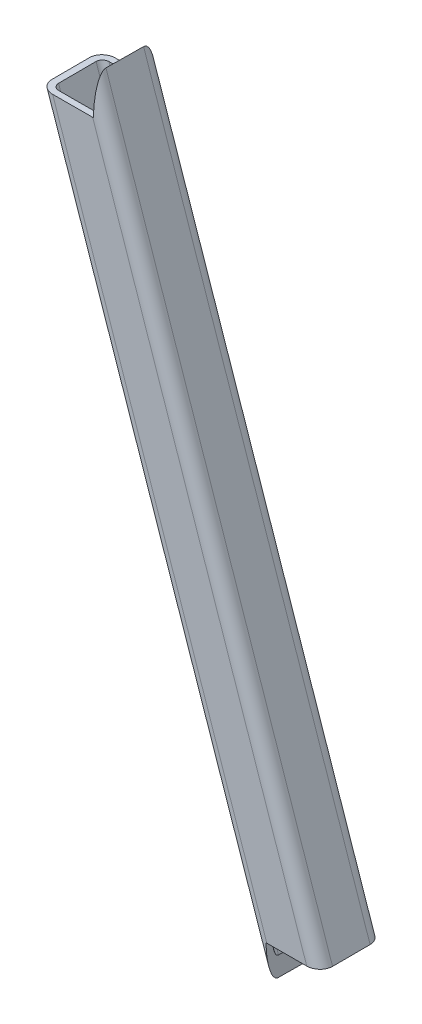
ISO-10303-21;
HEADER;
FILE_DESCRIPTION(('STEP AP214'),'2;1');
FILE_NAME('part.step','',(''),(''),'','','');
FILE_SCHEMA(('AUTOMOTIVE_DESIGN { 1 0 10303 214 1 1 1 1 }'));
ENDSEC;
DATA;
#1=APPLICATION_CONTEXT('core data for automotive mechanical design processes');
#2=APPLICATION_PROTOCOL_DEFINITION('international standard','automotive_design',2000,#1);
#3=PRODUCT_CONTEXT('',#1,'mechanical');
#4=PRODUCT('Part','Part','',(#3));
#5=PRODUCT_RELATED_PRODUCT_CATEGORY('part','',(#4));
#6=PRODUCT_DEFINITION_FORMATION('','',#4);
#7=PRODUCT_DEFINITION_CONTEXT('part definition',#1,'design');
#8=PRODUCT_DEFINITION('design','',#6,#7);
#9=PRODUCT_DEFINITION_SHAPE('','',#8);
#10=(LENGTH_UNIT() NAMED_UNIT(*) SI_UNIT(.MILLI.,.METRE.));
#11=(NAMED_UNIT(*) PLANE_ANGLE_UNIT() SI_UNIT($,.RADIAN.));
#12=(NAMED_UNIT(*) SI_UNIT($,.STERADIAN.) SOLID_ANGLE_UNIT());
#13=UNCERTAINTY_MEASURE_WITH_UNIT(LENGTH_MEASURE(1.E-05),#10,'distance_accuracy_value','');
#14=(GEOMETRIC_REPRESENTATION_CONTEXT(3) GLOBAL_UNCERTAINTY_ASSIGNED_CONTEXT((#13)) GLOBAL_UNIT_ASSIGNED_CONTEXT((#10,
#11,#12)) REPRESENTATION_CONTEXT('',''));
#15=CARTESIAN_POINT('',(0.,0.,0.));
#16=DIRECTION('',(0.,0.,1.));
#17=DIRECTION('',(1.,0.,0.));
#18=AXIS2_PLACEMENT_3D('',#15,#16,#17);
#19=CARTESIAN_POINT('',(-240.552316834698,223.22080107908,-2306.03056574602));
#20=DIRECTION('',(-0.946505758584915,-0.322672417699403,0.00305938255488657));
#21=DIRECTION('',(0.322673927788139,-0.94651018817854,0.));
#22=AXIS2_PLACEMENT_3D('',#19,#20,#21);
#23=PLANE('',#22);
#24=DIRECTION('',(0.,-0.00948096236960194,-0.999955054666232));
#25=VECTOR('',#24,1.);
#26=CARTESIAN_POINT('',(-240.,221.600817328539,-2306.01520605069));
#27=LINE('',#26,#25);
#28=CARTESIAN_POINT('',(-240.,221.714447827,-2294.03062190508));
#29=VERTEX_POINT('',#28);
#30=CARTESIAN_POINT('',(-240.,221.6006716973,-2306.03056574602));
#31=VERTEX_POINT('',#30);
#32=EDGE_CURVE('E290',#29,#31,#27,.T.);
#33=ORIENTED_EDGE('',*,*,#32,.F.);
#34=DIRECTION('',(0.322673927788139,-0.94651018817854,0.));
#35=VECTOR('',#34,1.);
#36=CARTESIAN_POINT('',(-240.517567993605,223.232647274908,-2294.03062190508));
#37=LINE('',#36,#35);
#38=CARTESIAN_POINT('',(-167.824620058977,10.,-2294.03062190508));
#39=VERTEX_POINT('',#38);
#40=EDGE_CURVE('E247',#29,#39,#37,.T.);
#41=ORIENTED_EDGE('',*,*,#40,.T.);
#42=DIRECTION('',(0.00323227465389861,0.,0.999994776186637));
#43=VECTOR('',#42,1.);
#44=CARTESIAN_POINT('',(-167.86416680053,10.,-2306.26551503834));
#45=LINE('',#44,#43);
#46=CARTESIAN_POINT('',(-167.86340737592,10.,-2306.03056574602));
#47=VERTEX_POINT('',#46);
#48=EDGE_CURVE('E266',#47,#39,#45,.T.);
#49=ORIENTED_EDGE('',*,*,#48,.F.);
#50=DIRECTION('',(0.322673927788139,-0.94651018817854,0.));
#51=VECTOR('',#50,1.);
#52=CARTESIAN_POINT('',(-240.552316834698,223.22080107908,-2306.03056574602));
#53=LINE('',#52,#51);
#54=EDGE_CURVE('E244',#31,#47,#53,.T.);
#55=ORIENTED_EDGE('',*,*,#54,.F.);
#56=EDGE_LOOP('',(#33,#41,#49,#55));
#57=FACE_BOUND('',#56,.T.);
#58=ADVANCED_FACE('F41',(#57),#23,.F.);
#59=CARTESIAN_POINT('',(-244.303591027944,221.94195760411,-2294.01838437486));
#60=DIRECTION('',(0.322673927788139,-0.94651018817854,0.));
#61=DIRECTION('',(0.94651018817854,0.322673927788139,0.));
#62=AXIS2_PLACEMENT_3D('',#59,#60,#61);
#63=CYLINDRICAL_SURFACE('',#62,3.99999999999994);
#64=CARTESIAN_POINT('',(-240.232469117452,210.,-2294.01838437486));
#65=DIRECTION('',(0.,1.,0.));
#66=DIRECTION('',(1.,0.,0.));
#67=AXIS2_PLACEMENT_3D('',#64,#65,#66);
#68=ELLIPSE('',#67,4.22605065424338,3.99999999999994);
#69=CARTESIAN_POINT('',(-240.219540011804,210.,-2290.01840309455));
#70=VERTEX_POINT('',#69);
#71=CARTESIAN_POINT('',(-240.,210.,-2290.02444085147));
#72=VERTEX_POINT('',#71);
#73=EDGE_CURVE('E229',#70,#72,#68,.T.);
#74=ORIENTED_EDGE('',*,*,#73,.F.);
#75=DIRECTION('',(0.322673927788139,-0.94651018817854,0.));
#76=VECTOR('',#75,1.);
#77=CARTESIAN_POINT('',(-244.292008080913,221.945906336053,-2290.01840309455));
#78=LINE('',#77,#76);
#79=CARTESIAN_POINT('',(-172.037721829986,10.,-2290.01840309455));
#80=VERTEX_POINT('',#79);
#81=EDGE_CURVE('E251',#70,#80,#78,.T.);
#82=ORIENTED_EDGE('',*,*,#81,.T.);
#83=CARTESIAN_POINT('',(-172.050650935634,10.,-2294.01838437486));
#84=DIRECTION('',(0.,-1.,0.));
#85=DIRECTION('',(1.,0.,0.));
#86=AXIS2_PLACEMENT_3D('',#83,#84,#85);
#87=ELLIPSE('',#86,4.22605065424338,3.99999999999994);
#88=EDGE_CURVE('E197',#39,#80,#87,.T.);
#89=ORIENTED_EDGE('',*,*,#88,.F.);
#90=ORIENTED_EDGE('',*,*,#40,.F.);
#91=CARTESIAN_POINT('',(-240.,209.318090588806,-2294.01838437486));
#92=DIRECTION('',(-1.,0.,0.));
#93=DIRECTION('',(0.,-1.,0.));
#94=AXIS2_PLACEMENT_3D('',#91,#92,#93);
#95=ELLIPSE('',#94,12.3964152524473,3.99999999999994);
#96=EDGE_CURVE('E346',#72,#29,#95,.T.);
#97=ORIENTED_EDGE('',*,*,#96,.F.);
#98=EDGE_LOOP('',(#74,#82,#89,#90,#97));
#99=FACE_BOUND('',#98,.T.);
#100=ADVANCED_FACE('F371',(#99),#63,.T.);
#101=CARTESIAN_POINT('',(-255.650077183932,218.073837323659,-2289.98169050389));
#102=DIRECTION('',(-0.00289573675775556,-0.000987182985598487,-0.99999532007824));
#103=DIRECTION('',(-0.99999580734144,0.,0.00289573816874812));
#104=AXIS2_PLACEMENT_3D('',#101,#102,#103);
#105=PLANE('',#104);
#106=DIRECTION('',(0.99999580734144,0.,-0.00289573816874812));
#107=VECTOR('',#106,1.);
#108=CARTESIAN_POINT('',(-255.65005410386,210.,-2289.97372017859));
#109=LINE('',#108,#107);
#110=CARTESIAN_POINT('',(-252.897632641826,210.,-2289.98169050389));
#111=VERTEX_POINT('',#110);
#112=EDGE_CURVE('E231',#111,#70,#109,.T.);
#113=ORIENTED_EDGE('',*,*,#112,.F.);
#114=DIRECTION('',(0.322673927788139,-0.94651018817854,0.));
#115=VECTOR('',#114,1.);
#116=CARTESIAN_POINT('',(-255.650077183932,218.073837323659,-2289.98169050389));
#117=LINE('',#116,#115);
#118=CARTESIAN_POINT('',(-184.715814459964,10.,-2289.98169050389));
#119=VERTEX_POINT('',#118);
#120=EDGE_CURVE('E254',#111,#119,#117,.T.);
#121=ORIENTED_EDGE('',*,*,#120,.T.);
#122=DIRECTION('',(-0.99999580734144,0.,0.00289573816874812));
#123=VECTOR('',#122,1.);
#124=CARTESIAN_POINT('',(-255.649482378891,10.,-2289.77628431305));
#125=LINE('',#124,#123);
#126=EDGE_CURVE('E185',#80,#119,#125,.T.);
#127=ORIENTED_EDGE('',*,*,#126,.F.);
#128=ORIENTED_EDGE('',*,*,#81,.F.);
#129=EDGE_LOOP('',(#113,#121,#127,#128));
#130=FACE_BOUND('',#129,.T.);
#131=ADVANCED_FACE('F375',(#130),#105,.F.);
#132=CARTESIAN_POINT('',(-255.661660130963,218.069888591717,-2293.9816717842));
#133=DIRECTION('',(0.322673927788139,-0.94651018817854,0.));
#134=DIRECTION('',(0.94651018817854,0.322673927788139,0.));
#135=AXIS2_PLACEMENT_3D('',#132,#133,#134);
#136=CYLINDRICAL_SURFACE('',#135,3.99999999999996);
#137=CARTESIAN_POINT('',(-252.910561747423,210.,-2293.9816717842));
#138=DIRECTION('',(0.,1.,0.));
#139=DIRECTION('',(1.,0.,0.));
#140=AXIS2_PLACEMENT_3D('',#137,#138,#139);
#141=ELLIPSE('',#140,4.2260506542434,3.99999999999996);
#142=CARTESIAN_POINT('',(-257.13659262408,210.,-2293.96943425398));
#143=VERTEX_POINT('',#142);
#144=EDGE_CURVE('E233',#143,#111,#141,.T.);
#145=ORIENTED_EDGE('',*,*,#144,.F.);
#146=DIRECTION('',(0.322673927788139,-0.94651018817854,0.));
#147=VECTOR('',#146,1.);
#148=CARTESIAN_POINT('',(-259.447683165303,216.779198920919,-2293.96943425398));
#149=LINE('',#148,#147);
#150=CARTESIAN_POINT('',(-184.999999999999,-1.60067169730313,-2293.96943425398));
#151=VERTEX_POINT('',#150);
#152=EDGE_CURVE('E204',#143,#151,#149,.T.);
#153=ORIENTED_EDGE('',*,*,#152,.T.);
#154=CARTESIAN_POINT('',(-184.999999999999,10.7956855408894,-2293.9816717842));
#155=DIRECTION('',(1.,0.,0.));
#156=DIRECTION('',(0.,-1.,0.));
#157=AXIS2_PLACEMENT_3D('',#154,#155,#156);
#158=ELLIPSE('',#157,12.3964152524473,3.99999999999996);
#159=CARTESIAN_POINT('',(-184.999999999999,10.,-2289.98992016506));
#160=VERTEX_POINT('',#159);
#161=EDGE_CURVE('E193',#160,#151,#158,.T.);
#162=ORIENTED_EDGE('',*,*,#161,.F.);
#163=CARTESIAN_POINT('',(-184.728743565605,10.,-2293.9816717842));
#164=DIRECTION('',(0.,-1.,0.));
#165=DIRECTION('',(1.,0.,0.));
#166=AXIS2_PLACEMENT_3D('',#163,#164,#165);
#167=ELLIPSE('',#166,4.2260506542434,3.99999999999996);
#168=EDGE_CURVE('E178',#119,#160,#167,.T.);
#169=ORIENTED_EDGE('',*,*,#168,.F.);
#170=ORIENTED_EDGE('',*,*,#120,.F.);
#171=EDGE_LOOP('',(#145,#153,#162,#169,#170));
#172=FACE_BOUND('',#171,.T.);
#173=ADVANCED_FACE('F202',(#172),#136,.T.);
#174=CARTESIAN_POINT('',(-259.447683165303,216.779198920919,-2293.96943425398));
#175=DIRECTION('',(0.946505758584915,0.322672417699403,-0.00305938255488657));
#176=DIRECTION('',(-0.322673927788139,0.94651018817854,0.));
#177=AXIS2_PLACEMENT_3D('',#174,#175,#176);
#178=PLANE('',#177);
#179=DIRECTION('',(0.00323227465389861,0.,0.999994776186637));
#180=VECTOR('',#179,1.);
#181=CARTESIAN_POINT('',(-257.136616769428,210.,-2293.97690429434));
#182=LINE('',#181,#180);
#183=CARTESIAN_POINT('',(-257.175379941023,210.,-2305.96937809492));
#184=VERTEX_POINT('',#183);
#185=EDGE_CURVE('E235',#184,#143,#182,.T.);
#186=ORIENTED_EDGE('',*,*,#185,.F.);
#187=DIRECTION('',(0.322673927788139,-0.94651018817854,0.));
#188=VECTOR('',#187,1.);
#189=CARTESIAN_POINT('',(-259.482432006396,216.767352725092,-2305.96937809492));
#190=LINE('',#189,#188);
#191=CARTESIAN_POINT('',(-184.999999999999,-1.71444782700251,-2305.96937809492));
#192=VERTEX_POINT('',#191);
#193=EDGE_CURVE('E257',#184,#192,#190,.T.);
#194=ORIENTED_EDGE('',*,*,#193,.T.);
#195=DIRECTION('',(0.,-0.0094809623696014,-0.999955054666232));
#196=VECTOR('',#195,1.);
#197=CARTESIAN_POINT('',(-184.999999999999,-1.58104182610211,-2291.8990759755));
#198=LINE('',#197,#196);
#199=EDGE_CURVE('E205',#151,#192,#198,.T.);
#200=ORIENTED_EDGE('',*,*,#199,.F.);
#201=ORIENTED_EDGE('',*,*,#152,.F.);
#202=EDGE_LOOP('',(#186,#194,#200,#201));
#203=FACE_BOUND('',#202,.T.);
#204=ADVANCED_FACE('F378',(#203),#178,.F.);
#205=CARTESIAN_POINT('',(-255.696408972056,218.05804239589,-2305.98161562514));
#206=DIRECTION('',(0.322673927788139,-0.94651018817854,0.));
#207=DIRECTION('',(0.94651018817854,0.322673927788139,0.));
#208=AXIS2_PLACEMENT_3D('',#205,#206,#207);
#209=CYLINDRICAL_SURFACE('',#208,3.99999999999994);
#210=CARTESIAN_POINT('',(-252.949349064366,210.,-2305.98161562514));
#211=DIRECTION('',(0.,1.,0.));
#212=DIRECTION('',(1.,0.,0.));
#213=AXIS2_PLACEMENT_3D('',#210,#211,#212);
#214=ELLIPSE('',#213,4.22605065424338,3.99999999999994);
#215=CARTESIAN_POINT('',(-252.962278170014,210.,-2309.98159690545));
#216=VERTEX_POINT('',#215);
#217=EDGE_CURVE('E237',#216,#184,#214,.T.);
#218=ORIENTED_EDGE('',*,*,#217,.F.);
#219=DIRECTION('',(0.322673927788139,-0.94651018817854,0.));
#220=VECTOR('',#219,1.);
#221=CARTESIAN_POINT('',(-255.707991919087,218.054093663948,-2309.98159690545));
#222=LINE('',#221,#220);
#223=CARTESIAN_POINT('',(-184.780459988349,10.,-2309.98159690545));
#224=VERTEX_POINT('',#223);
#225=EDGE_CURVE('E260',#216,#224,#222,.T.);
#226=ORIENTED_EDGE('',*,*,#225,.T.);
#227=CARTESIAN_POINT('',(-184.767530882548,10.,-2305.98161562514));
#228=DIRECTION('',(0.,-1.,0.));
#229=DIRECTION('',(1.,0.,0.));
#230=AXIS2_PLACEMENT_3D('',#227,#228,#229);
#231=ELLIPSE('',#230,4.22605065424338,3.99999999999994);
#232=CARTESIAN_POINT('',(-184.999999999999,10.,-2309.97555914853));
#233=VERTEX_POINT('',#232);
#234=EDGE_CURVE('E329',#233,#224,#231,.T.);
#235=ORIENTED_EDGE('',*,*,#234,.F.);
#236=CARTESIAN_POINT('',(-184.999999999999,10.6819094111907,-2305.98161562514));
#237=DIRECTION('',(1.,0.,0.));
#238=DIRECTION('',(0.,-1.,0.));
#239=AXIS2_PLACEMENT_3D('',#236,#237,#238);
#240=ELLIPSE('',#239,12.3964152524473,3.99999999999994);
#241=EDGE_CURVE('E207',#192,#233,#240,.T.);
#242=ORIENTED_EDGE('',*,*,#241,.F.);
#243=ORIENTED_EDGE('',*,*,#193,.F.);
#244=EDGE_LOOP('',(#218,#226,#235,#242,#243));
#245=FACE_BOUND('',#244,.T.);
#246=ADVANCED_FACE('F384',(#245),#209,.T.);
#247=CARTESIAN_POINT('',(-244.349922816068,221.92616267634,-2310.01830949611));
#248=DIRECTION('',(0.00289573675775556,0.000987182985598487,0.99999532007824));
#249=DIRECTION('',(0.99999580734144,0.,-0.00289573816874812));
#250=AXIS2_PLACEMENT_3D('',#247,#248,#249);
#251=PLANE('',#250);
#252=DIRECTION('',(-0.99999580734144,0.,0.00289573816874812));
#253=VECTOR('',#252,1.);
#254=CARTESIAN_POINT('',(-244.349888723643,210.,-2310.00653623486));
#255=LINE('',#254,#253);
#256=CARTESIAN_POINT('',(-240.284185539927,210.,-2310.01830949611));
#257=VERTEX_POINT('',#256);
#258=EDGE_CURVE('E239',#257,#216,#255,.T.);
#259=ORIENTED_EDGE('',*,*,#258,.F.);
#260=DIRECTION('',(0.322673927788139,-0.94651018817854,0.));
#261=VECTOR('',#260,1.);
#262=CARTESIAN_POINT('',(-244.349922816068,221.92616267634,-2310.01830949611));
#263=LINE('',#262,#261);
#264=CARTESIAN_POINT('',(-172.102367358225,10.,-2310.01830949611));
#265=VERTEX_POINT('',#264);
#266=EDGE_CURVE('E263',#257,#265,#263,.T.);
#267=ORIENTED_EDGE('',*,*,#266,.T.);
#268=DIRECTION('',(0.99999580734144,0.,-0.00289573816874812));
#269=VECTOR('',#268,1.);
#270=CARTESIAN_POINT('',(-244.349316998674,10.,-2309.80910036932));
#271=LINE('',#270,#269);
#272=EDGE_CURVE('E327',#224,#265,#271,.T.);
#273=ORIENTED_EDGE('',*,*,#272,.F.);
#274=ORIENTED_EDGE('',*,*,#225,.F.);
#275=EDGE_LOOP('',(#259,#267,#273,#274));
#276=FACE_BOUND('',#275,.T.);
#277=ADVANCED_FACE('F390',(#276),#251,.F.);
#278=CARTESIAN_POINT('',(-244.338339869037,221.930111408283,-2306.0183282158));
#279=DIRECTION('',(0.322673927788139,-0.94651018817854,0.));
#280=DIRECTION('',(0.94651018817854,0.322673927788139,0.));
#281=AXIS2_PLACEMENT_3D('',#278,#279,#280);
#282=CYLINDRICAL_SURFACE('',#281,3.99999999999996);
#283=CARTESIAN_POINT('',(-240.271256434395,210.,-2306.0183282158));
#284=DIRECTION('',(0.,1.,0.));
#285=DIRECTION('',(1.,0.,0.));
#286=AXIS2_PLACEMENT_3D('',#283,#284,#285);
#287=ELLIPSE('',#286,4.2260506542434,3.99999999999996);
#288=CARTESIAN_POINT('',(-240.,210.,-2310.01007983494));
#289=VERTEX_POINT('',#288);
#290=EDGE_CURVE('E241',#289,#257,#287,.T.);
#291=ORIENTED_EDGE('',*,*,#290,.F.);
#292=CARTESIAN_POINT('',(-240.,209.204314459108,-2306.0183282158));
#293=DIRECTION('',(-1.,0.,0.));
#294=DIRECTION('',(0.,-1.,0.));
#295=AXIS2_PLACEMENT_3D('',#292,#293,#294);
#296=ELLIPSE('',#295,12.3964152524473,3.99999999999996);
#297=EDGE_CURVE('E319',#31,#289,#296,.T.);
#298=ORIENTED_EDGE('',*,*,#297,.F.);
#299=ORIENTED_EDGE('',*,*,#54,.T.);
#300=CARTESIAN_POINT('',(-172.089438252577,10.,-2306.0183282158));
#301=DIRECTION('',(0.,-1.,0.));
#302=DIRECTION('',(1.,0.,0.));
#303=AXIS2_PLACEMENT_3D('',#300,#301,#302);
#304=ELLIPSE('',#303,4.2260506542434,3.99999999999996);
#305=EDGE_CURVE('E190',#265,#47,#304,.T.);
#306=ORIENTED_EDGE('',*,*,#305,.F.);
#307=ORIENTED_EDGE('',*,*,#266,.F.);
#308=EDGE_LOOP('',(#291,#298,#299,#306,#307));
#309=FACE_BOUND('',#308,.T.);
#310=ADVANCED_FACE('F393',(#309),#282,.T.);
#311=CARTESIAN_POINT('',(-184.999999999999,-6.00000000000001,-2000.));
#312=DIRECTION('',(1.,0.,0.));
#313=DIRECTION('',(0.,0.,-1.));
#314=AXIS2_PLACEMENT_3D('',#311,#312,#313);
#315=PLANE('',#314);
#316=ORIENTED_EDGE('',*,*,#241,.T.);
#317=DIRECTION('',(0.,0.,-1.));
#318=VECTOR('',#317,1.);
#319=CARTESIAN_POINT('',(-184.999999999999,10.,-2000.));
#320=LINE('',#319,#318);
#321=CARTESIAN_POINT('',(-184.999999999999,10.,-2307.96947499342));
#322=VERTEX_POINT('',#321);
#323=EDGE_CURVE('E198',#322,#233,#320,.T.);
#324=ORIENTED_EDGE('',*,*,#323,.F.);
#325=CARTESIAN_POINT('',(-184.999999999999,10.6819094111907,-2305.98161562514));
#326=DIRECTION('',(1.,0.,0.));
#327=DIRECTION('',(0.,-1.,0.));
#328=AXIS2_PLACEMENT_3D('',#325,#326,#327);
#329=ELLIPSE('',#328,6.19820762622395,2.00000000000008);
#330=CARTESIAN_POINT('',(-184.999999999999,4.48373079209316,-2305.97549686003));
#331=VERTEX_POINT('',#330);
#332=EDGE_CURVE('E56',#331,#322,#329,.T.);
#333=ORIENTED_EDGE('',*,*,#332,.F.);
#334=DIRECTION('',(0.,-0.009480962369716,-0.99995505466623));
#335=VECTOR('',#334,1.);
#336=CARTESIAN_POINT('',(-184.999999999999,4.61663765627701,-2291.95783858253));
#337=LINE('',#336,#335);
#338=CARTESIAN_POINT('',(-184.999999999999,4.59750692179389,-2293.97555301909));
#339=VERTEX_POINT('',#338);
#340=EDGE_CURVE('E49',#339,#331,#337,.T.);
#341=ORIENTED_EDGE('',*,*,#340,.F.);
#342=CARTESIAN_POINT('',(-184.999999999999,10.7956855408894,-2293.9816717842));
#343=DIRECTION('',(1.,0.,0.));
#344=DIRECTION('',(0.,-1.,0.));
#345=AXIS2_PLACEMENT_3D('',#342,#343,#344);
#346=ELLIPSE('',#345,6.1982076262233,1.99999999999987);
#347=CARTESIAN_POINT('',(-184.999999999999,10.,-2291.99821999782));
#348=VERTEX_POINT('',#347);
#349=EDGE_CURVE('E196',#348,#339,#346,.T.);
#350=ORIENTED_EDGE('',*,*,#349,.F.);
#351=EDGE_CURVE('E182',#160,#348,#320,.T.);
#352=ORIENTED_EDGE('',*,*,#351,.F.);
#353=ORIENTED_EDGE('',*,*,#161,.T.);
#354=ORIENTED_EDGE('',*,*,#199,.T.);
#355=EDGE_LOOP('',(#316,#324,#333,#341,#350,#352,#353,#354));
#356=FACE_BOUND('',#355,.T.);
#357=ADVANCED_FACE('F192',(#356),#315,.T.);
#358=CARTESIAN_POINT('',(-143.999999999999,10.,-200.));
#359=DIRECTION('',(0.,-1.,0.));
#360=DIRECTION('',(0.,0.,-1.));
#361=AXIS2_PLACEMENT_3D('',#358,#359,#360);
#362=PLANE('',#361);
#363=ORIENTED_EDGE('',*,*,#323,.T.);
#364=ORIENTED_EDGE('',*,*,#234,.T.);
#365=ORIENTED_EDGE('',*,*,#272,.T.);
#366=ORIENTED_EDGE('',*,*,#305,.T.);
#367=ORIENTED_EDGE('',*,*,#48,.T.);
#368=ORIENTED_EDGE('',*,*,#88,.T.);
#369=ORIENTED_EDGE('',*,*,#126,.T.);
#370=ORIENTED_EDGE('',*,*,#168,.T.);
#371=ORIENTED_EDGE('',*,*,#351,.T.);
#372=CARTESIAN_POINT('',(-184.728743565605,10.,-2293.9816717842));
#373=DIRECTION('',(0.,-1.,0.));
#374=DIRECTION('',(1.,0.,0.));
#375=AXIS2_PLACEMENT_3D('',#372,#373,#374);
#376=ELLIPSE('',#375,2.11302532712158,1.99999999999987);
#377=CARTESIAN_POINT('',(-184.722279012781,10.,-2291.98168114404));
#378=VERTEX_POINT('',#377);
#379=EDGE_CURVE('E331',#378,#348,#376,.T.);
#380=ORIENTED_EDGE('',*,*,#379,.F.);
#381=DIRECTION('',(-0.99999580734144,0.,0.00289573816874812));
#382=VECTOR('',#381,1.);
#383=CARTESIAN_POINT('',(-255.655273858051,10.,-2291.77627690226));
#384=LINE('',#383,#382);
#385=CARTESIAN_POINT('',(-172.044186382688,10.,-2292.0183937347));
#386=VERTEX_POINT('',#385);
#387=EDGE_CURVE('E333',#386,#378,#384,.T.);
#388=ORIENTED_EDGE('',*,*,#387,.F.);
#389=CARTESIAN_POINT('',(-172.050650935634,10.,-2294.01838437486));
#390=DIRECTION('',(0.,-1.,0.));
#391=DIRECTION('',(1.,0.,0.));
#392=AXIS2_PLACEMENT_3D('',#389,#390,#391);
#393=ELLIPSE('',#392,2.1130253271218,2.00000000000008);
#394=CARTESIAN_POINT('',(-169.937635497305,10.,-2294.02450313997));
#395=VERTEX_POINT('',#394);
#396=EDGE_CURVE('E336',#395,#386,#393,.T.);
#397=ORIENTED_EDGE('',*,*,#396,.F.);
#398=DIRECTION('',(0.00323227465393768,0.,0.999994776186637));
#399=VECTOR('',#398,1.);
#400=CARTESIAN_POINT('',(-169.977179940345,10.,-2306.25868516385));
#401=LINE('',#400,#399);
#402=CARTESIAN_POINT('',(-169.976422814249,10.,-2306.02444698091));
#403=VERTEX_POINT('',#402);
#404=EDGE_CURVE('E339',#403,#395,#401,.T.);
#405=ORIENTED_EDGE('',*,*,#404,.F.);
#406=CARTESIAN_POINT('',(-172.089438252577,10.,-2306.0183282158));
#407=DIRECTION('',(0.,-1.,0.));
#408=DIRECTION('',(1.,0.,0.));
#409=AXIS2_PLACEMENT_3D('',#406,#407,#408);
#410=ELLIPSE('',#409,2.11302532712158,1.99999999999987);
#411=CARTESIAN_POINT('',(-172.095902805401,10.,-2308.01831885595));
#412=VERTEX_POINT('',#411);
#413=EDGE_CURVE('E309',#412,#403,#410,.T.);
#414=ORIENTED_EDGE('',*,*,#413,.F.);
#415=DIRECTION('',(0.99999580734144,0.,-0.00289573816874812));
#416=VECTOR('',#415,1.);
#417=CARTESIAN_POINT('',(-244.343525519515,10.,-2307.80910778011));
#418=LINE('',#417,#416);
#419=CARTESIAN_POINT('',(-184.773995435494,10.,-2307.9816062653));
#420=VERTEX_POINT('',#419);
#421=EDGE_CURVE('E303',#420,#412,#418,.T.);
#422=ORIENTED_EDGE('',*,*,#421,.F.);
#423=CARTESIAN_POINT('',(-184.767530882548,10.,-2305.98161562514));
#424=DIRECTION('',(0.,-1.,0.));
#425=DIRECTION('',(1.,0.,0.));
#426=AXIS2_PLACEMENT_3D('',#423,#424,#425);
#427=ELLIPSE('',#426,2.1130253271218,2.00000000000008);
#428=EDGE_CURVE('E344',#322,#420,#427,.T.);
#429=ORIENTED_EDGE('',*,*,#428,.F.);
#430=EDGE_LOOP('',(#363,#364,#365,#366,#367,#368,#369,#370,#371,#380,#388,#397,#405,#414,#422,#429));
#431=FACE_BOUND('',#430,.T.);
#432=ADVANCED_FACE('F181',(#431),#362,.T.);
#433=CARTESIAN_POINT('',(-240.,214.,-2300.));
#434=DIRECTION('',(-1.,0.,0.));
#435=DIRECTION('',(0.,0.,1.));
#436=AXIS2_PLACEMENT_3D('',#433,#434,#435);
#437=PLANE('',#436);
#438=DIRECTION('',(0.,-0.00948096236971654,-0.99995505466623));
#439=VECTOR('',#438,1.);
#440=CARTESIAN_POINT('',(-240.,215.403137846161,-2305.95644344364));
#441=LINE('',#440,#439);
#442=CARTESIAN_POINT('',(-240.,215.516269207905,-2294.02450313997));
#443=VERTEX_POINT('',#442);
#444=CARTESIAN_POINT('',(-240.,215.402493078203,-2306.02444698091));
#445=VERTEX_POINT('',#444);
#446=EDGE_CURVE('E352',#443,#445,#441,.T.);
#447=ORIENTED_EDGE('',*,*,#446,.F.);
#448=CARTESIAN_POINT('',(-240.,209.318090588806,-2294.01838437486));
#449=DIRECTION('',(-1.,0.,0.));
#450=DIRECTION('',(0.,-1.,0.));
#451=AXIS2_PLACEMENT_3D('',#448,#449,#450);
#452=ELLIPSE('',#451,6.19820762622395,2.00000000000008);
#453=CARTESIAN_POINT('',(-240.,210.,-2292.03052500658));
#454=VERTEX_POINT('',#453);
#455=EDGE_CURVE('E349',#454,#443,#452,.T.);
#456=ORIENTED_EDGE('',*,*,#455,.F.);
#457=DIRECTION('',(0.,0.,1.));
#458=VECTOR('',#457,1.);
#459=CARTESIAN_POINT('',(-240.,210.,-2300.));
#460=LINE('',#459,#458);
#461=EDGE_CURVE('E320',#454,#72,#460,.T.);
#462=ORIENTED_EDGE('',*,*,#461,.T.);
#463=ORIENTED_EDGE('',*,*,#96,.T.);
#464=ORIENTED_EDGE('',*,*,#32,.T.);
#465=ORIENTED_EDGE('',*,*,#297,.T.);
#466=CARTESIAN_POINT('',(-240.,210.,-2308.00178000218));
#467=VERTEX_POINT('',#466);
#468=EDGE_CURVE('E313',#289,#467,#460,.T.);
#469=ORIENTED_EDGE('',*,*,#468,.T.);
#470=CARTESIAN_POINT('',(-240.,209.204314459108,-2306.0183282158));
#471=DIRECTION('',(-1.,0.,0.));
#472=DIRECTION('',(0.,-1.,0.));
#473=AXIS2_PLACEMENT_3D('',#470,#471,#472);
#474=ELLIPSE('',#473,6.1982076262233,1.99999999999987);
#475=EDGE_CURVE('E310',#445,#467,#474,.T.);
#476=ORIENTED_EDGE('',*,*,#475,.F.);
#477=EDGE_LOOP('',(#447,#456,#462,#463,#464,#465,#469,#476));
#478=FACE_BOUND('',#477,.T.);
#479=ADVANCED_FACE('F316',(#478),#437,.T.);
#480=CARTESIAN_POINT('',(-244.,210.,-2300.));
#481=DIRECTION('',(0.,1.,0.));
#482=DIRECTION('',(0.,0.,1.));
#483=AXIS2_PLACEMENT_3D('',#480,#481,#482);
#484=PLANE('',#483);
#485=ORIENTED_EDGE('',*,*,#290,.T.);
#486=ORIENTED_EDGE('',*,*,#258,.T.);
#487=ORIENTED_EDGE('',*,*,#217,.T.);
#488=ORIENTED_EDGE('',*,*,#185,.T.);
#489=ORIENTED_EDGE('',*,*,#144,.T.);
#490=ORIENTED_EDGE('',*,*,#112,.T.);
#491=ORIENTED_EDGE('',*,*,#73,.T.);
#492=ORIENTED_EDGE('',*,*,#461,.F.);
#493=CARTESIAN_POINT('',(-240.232469117452,210.,-2294.01838437486));
#494=DIRECTION('',(0.,1.,0.));
#495=DIRECTION('',(1.,0.,0.));
#496=AXIS2_PLACEMENT_3D('',#493,#494,#495);
#497=ELLIPSE('',#496,2.1130253271218,2.00000000000008);
#498=CARTESIAN_POINT('',(-240.22600456455,210.,-2292.0183937347));
#499=VERTEX_POINT('',#498);
#500=EDGE_CURVE('E217',#499,#454,#497,.T.);
#501=ORIENTED_EDGE('',*,*,#500,.F.);
#502=DIRECTION('',(0.99999580734144,0.,-0.00289573816874812));
#503=VECTOR('',#502,1.);
#504=CARTESIAN_POINT('',(-255.65584558302,210.,-2291.9737127678));
#505=LINE('',#504,#503);
#506=CARTESIAN_POINT('',(-252.904097194599,210.,-2291.98168114404));
#507=VERTEX_POINT('',#506);
#508=EDGE_CURVE('E214',#507,#499,#505,.T.);
#509=ORIENTED_EDGE('',*,*,#508,.F.);
#510=CARTESIAN_POINT('',(-252.910561747423,210.,-2293.9816717842));
#511=DIRECTION('',(0.,1.,0.));
#512=DIRECTION('',(1.,0.,0.));
#513=AXIS2_PLACEMENT_3D('',#510,#511,#512);
#514=ELLIPSE('',#513,2.11302532712158,1.99999999999987);
#515=CARTESIAN_POINT('',(-255.023577185751,210.,-2293.97555301909));
#516=VERTEX_POINT('',#515);
#517=EDGE_CURVE('E64',#516,#507,#514,.T.);
#518=ORIENTED_EDGE('',*,*,#517,.F.);
#519=DIRECTION('',(0.00323227465393768,0.,0.999994776186637));
#520=VECTOR('',#519,1.);
#521=CARTESIAN_POINT('',(-255.023603629613,210.,-2293.98373416883));
#522=LINE('',#521,#520);
#523=CARTESIAN_POINT('',(-255.062364502695,210.,-2305.97549686003));
#524=VERTEX_POINT('',#523);
#525=EDGE_CURVE('E11',#524,#516,#522,.T.);
#526=ORIENTED_EDGE('',*,*,#525,.F.);
#527=CARTESIAN_POINT('',(-252.949349064366,210.,-2305.98161562514));
#528=DIRECTION('',(0.,1.,0.));
#529=DIRECTION('',(1.,0.,0.));
#530=AXIS2_PLACEMENT_3D('',#527,#528,#529);
#531=ELLIPSE('',#530,2.1130253271218,2.00000000000008);
#532=CARTESIAN_POINT('',(-252.95581361719,210.,-2307.9816062653));
#533=VERTEX_POINT('',#532);
#534=EDGE_CURVE('E220',#533,#524,#531,.T.);
#535=ORIENTED_EDGE('',*,*,#534,.F.);
#536=DIRECTION('',(-0.99999580734144,0.,0.00289573816874812));
#537=VECTOR('',#536,1.);
#538=CARTESIAN_POINT('',(-244.344097244484,210.,-2308.00654364565));
#539=LINE('',#538,#537);
#540=CARTESIAN_POINT('',(-240.277720987225,210.,-2308.01831885595));
#541=VERTEX_POINT('',#540);
#542=EDGE_CURVE('E223',#541,#533,#539,.T.);
#543=ORIENTED_EDGE('',*,*,#542,.F.);
#544=CARTESIAN_POINT('',(-240.271256434395,210.,-2306.0183282158));
#545=DIRECTION('',(0.,1.,0.));
#546=DIRECTION('',(1.,0.,0.));
#547=AXIS2_PLACEMENT_3D('',#544,#545,#546);
#548=ELLIPSE('',#547,2.11302532712158,1.99999999999987);
#549=EDGE_CURVE('E226',#467,#541,#548,.T.);
#550=ORIENTED_EDGE('',*,*,#549,.F.);
#551=ORIENTED_EDGE('',*,*,#468,.F.);
#552=EDGE_LOOP('',(#485,#486,#487,#488,#489,#490,#491,#492,#501,#509,#518,#526,#535,#543,#550,#551));
#553=FACE_BOUND('',#552,.T.);
#554=ADVANCED_FACE('F298',(#553),#484,.T.);
#555=CARTESIAN_POINT('',(-257.554671648133,217.424543756318,-2293.97555301909));
#556=DIRECTION('',(0.946505758584915,0.322672417699403,-0.00305938255492355));
#557=DIRECTION('',(-0.322673927788139,0.94651018817854,0.));
#558=AXIS2_PLACEMENT_3D('',#555,#556,#557);
#559=PLANE('',#558);
#560=DIRECTION('',(0.322673927788139,-0.94651018817854,0.));
#561=VECTOR('',#560,1.);
#562=CARTESIAN_POINT('',(-257.589420489226,217.412697560491,-2305.97549686003));
#563=LINE('',#562,#561);
#564=EDGE_CURVE('E243',#524,#331,#563,.T.);
#565=ORIENTED_EDGE('',*,*,#564,.F.);
#566=ORIENTED_EDGE('',*,*,#525,.T.);
#567=DIRECTION('',(0.322673927788139,-0.94651018817854,0.));
#568=VECTOR('',#567,1.);
#569=CARTESIAN_POINT('',(-257.554671648133,217.424543756318,-2293.97555301909));
#570=LINE('',#569,#568);
#571=EDGE_CURVE('E269',#516,#339,#570,.T.);
#572=ORIENTED_EDGE('',*,*,#571,.T.);
#573=ORIENTED_EDGE('',*,*,#340,.T.);
#574=EDGE_LOOP('',(#565,#566,#572,#573));
#575=FACE_BOUND('',#574,.T.);
#576=ADVANCED_FACE('F293',(#575),#559,.T.);
#577=CARTESIAN_POINT('',(-255.661660130963,218.069888591717,-2293.9816717842));
#578=DIRECTION('',(0.322673927788139,-0.94651018817854,0.));
#579=DIRECTION('',(0.94651018817854,0.322673927788139,0.));
#580=AXIS2_PLACEMENT_3D('',#577,#578,#579);
#581=CYLINDRICAL_SURFACE('',#580,1.99999999999987);
#582=ORIENTED_EDGE('',*,*,#571,.F.);
#583=ORIENTED_EDGE('',*,*,#517,.T.);
#584=DIRECTION('',(0.322673927788139,-0.94651018817854,0.));
#585=VECTOR('',#584,1.);
#586=CARTESIAN_POINT('',(-255.655868657447,218.071862957688,-2291.98168114404));
#587=LINE('',#586,#585);
#588=EDGE_CURVE('E272',#507,#378,#587,.T.);
#589=ORIENTED_EDGE('',*,*,#588,.T.);
#590=ORIENTED_EDGE('',*,*,#379,.T.);
#591=ORIENTED_EDGE('',*,*,#349,.T.);
#592=EDGE_LOOP('',(#582,#583,#589,#590,#591));
#593=FACE_BOUND('',#592,.T.);
#594=ADVANCED_FACE('F355',(#593),#581,.F.);
#595=CARTESIAN_POINT('',(-255.655868657447,218.071862957688,-2291.98168114404));
#596=DIRECTION('',(-0.00289573675775556,-0.000987182985598487,-0.99999532007824));
#597=DIRECTION('',(-0.99999580734144,0.,0.00289573816874812));
#598=AXIS2_PLACEMENT_3D('',#595,#596,#597);
#599=PLANE('',#598);
#600=ORIENTED_EDGE('',*,*,#588,.F.);
#601=ORIENTED_EDGE('',*,*,#508,.T.);
#602=DIRECTION('',(0.322673927788139,-0.94651018817854,0.));
#603=VECTOR('',#602,1.);
#604=CARTESIAN_POINT('',(-244.297799554429,221.943931970081,-2292.0183937347));
#605=LINE('',#604,#603);
#606=EDGE_CURVE('E275',#499,#386,#605,.T.);
#607=ORIENTED_EDGE('',*,*,#606,.T.);
#608=ORIENTED_EDGE('',*,*,#387,.T.);
#609=EDGE_LOOP('',(#600,#601,#607,#608));
#610=FACE_BOUND('',#609,.T.);
#611=ADVANCED_FACE('F358',(#610),#599,.T.);
#612=CARTESIAN_POINT('',(-244.303591027944,221.94195760411,-2294.01838437486));
#613=DIRECTION('',(0.322673927788139,-0.94651018817854,0.));
#614=DIRECTION('',(0.94651018817854,0.322673927788139,0.));
#615=AXIS2_PLACEMENT_3D('',#612,#613,#614);
#616=CYLINDRICAL_SURFACE('',#615,2.00000000000008);
#617=ORIENTED_EDGE('',*,*,#606,.F.);
#618=ORIENTED_EDGE('',*,*,#500,.T.);
#619=ORIENTED_EDGE('',*,*,#455,.T.);
#620=DIRECTION('',(0.322673927788139,-0.94651018817854,0.));
#621=VECTOR('',#620,1.);
#622=CARTESIAN_POINT('',(-242.410579510774,222.587302439509,-2294.02450313997));
#623=LINE('',#622,#621);
#624=EDGE_CURVE('E278',#443,#395,#623,.T.);
#625=ORIENTED_EDGE('',*,*,#624,.T.);
#626=ORIENTED_EDGE('',*,*,#396,.T.);
#627=EDGE_LOOP('',(#617,#618,#619,#625,#626));
#628=FACE_BOUND('',#627,.T.);
#629=ADVANCED_FACE('F361',(#628),#616,.F.);
#630=CARTESIAN_POINT('',(-242.445328351867,222.575456243682,-2306.02444698091));
#631=DIRECTION('',(-0.946505758584915,-0.322672417699403,0.00305938255492355));
#632=DIRECTION('',(0.322673927788139,-0.94651018817854,0.));
#633=AXIS2_PLACEMENT_3D('',#630,#631,#632);
#634=PLANE('',#633);
#635=ORIENTED_EDGE('',*,*,#624,.F.);
#636=ORIENTED_EDGE('',*,*,#446,.T.);
#637=DIRECTION('',(0.322673927788139,-0.94651018817854,0.));
#638=VECTOR('',#637,1.);
#639=CARTESIAN_POINT('',(-242.445328351867,222.575456243682,-2306.02444698091));
#640=LINE('',#639,#638);
#641=EDGE_CURVE('E281',#445,#403,#640,.T.);
#642=ORIENTED_EDGE('',*,*,#641,.T.);
#643=ORIENTED_EDGE('',*,*,#404,.T.);
#644=EDGE_LOOP('',(#635,#636,#642,#643));
#645=FACE_BOUND('',#644,.T.);
#646=ADVANCED_FACE('F364',(#645),#634,.T.);
#647=CARTESIAN_POINT('',(-244.338339869037,221.930111408283,-2306.0183282158));
#648=DIRECTION('',(0.322673927788139,-0.94651018817854,0.));
#649=DIRECTION('',(0.94651018817854,0.322673927788139,0.));
#650=AXIS2_PLACEMENT_3D('',#647,#648,#649);
#651=CYLINDRICAL_SURFACE('',#650,1.99999999999987);
#652=ORIENTED_EDGE('',*,*,#475,.T.);
#653=ORIENTED_EDGE('',*,*,#549,.T.);
#654=DIRECTION('',(0.322673927788139,-0.94651018817854,0.));
#655=VECTOR('',#654,1.);
#656=CARTESIAN_POINT('',(-244.344131342553,221.928137042312,-2308.01831885595));
#657=LINE('',#656,#655);
#658=EDGE_CURVE('E284',#541,#412,#657,.T.);
#659=ORIENTED_EDGE('',*,*,#658,.T.);
#660=ORIENTED_EDGE('',*,*,#413,.T.);
#661=ORIENTED_EDGE('',*,*,#641,.F.);
#662=EDGE_LOOP('',(#652,#653,#659,#660,#661));
#663=FACE_BOUND('',#662,.T.);
#664=ADVANCED_FACE('F307',(#663),#651,.F.);
#665=CARTESIAN_POINT('',(-244.344131342553,221.928137042312,-2308.01831885595));
#666=DIRECTION('',(0.00289573675775556,0.000987182985598487,0.99999532007824));
#667=DIRECTION('',(0.99999580734144,0.,-0.00289573816874812));
#668=AXIS2_PLACEMENT_3D('',#665,#666,#667);
#669=PLANE('',#668);
#670=ORIENTED_EDGE('',*,*,#658,.F.);
#671=ORIENTED_EDGE('',*,*,#542,.T.);
#672=DIRECTION('',(0.322673927788139,-0.94651018817854,0.));
#673=VECTOR('',#672,1.);
#674=CARTESIAN_POINT('',(-255.702200445572,218.056068029919,-2307.9816062653));
#675=LINE('',#674,#673);
#676=EDGE_CURVE('E248',#533,#420,#675,.T.);
#677=ORIENTED_EDGE('',*,*,#676,.T.);
#678=ORIENTED_EDGE('',*,*,#421,.T.);
#679=EDGE_LOOP('',(#670,#671,#677,#678));
#680=FACE_BOUND('',#679,.T.);
#681=ADVANCED_FACE('F301',(#680),#669,.T.);
#682=CARTESIAN_POINT('',(-255.696408972056,218.05804239589,-2305.98161562514));
#683=DIRECTION('',(0.322673927788139,-0.94651018817854,0.));
#684=DIRECTION('',(0.94651018817854,0.322673927788139,0.));
#685=AXIS2_PLACEMENT_3D('',#682,#683,#684);
#686=CYLINDRICAL_SURFACE('',#685,2.00000000000008);
#687=ORIENTED_EDGE('',*,*,#676,.F.);
#688=ORIENTED_EDGE('',*,*,#534,.T.);
#689=ORIENTED_EDGE('',*,*,#564,.T.);
#690=ORIENTED_EDGE('',*,*,#332,.T.);
#691=ORIENTED_EDGE('',*,*,#428,.T.);
#692=EDGE_LOOP('',(#687,#688,#689,#690,#691));
#693=FACE_BOUND('',#692,.T.);
#694=ADVANCED_FACE('F43',(#693),#686,.F.);
#695=CLOSED_SHELL('',(#58,#100,#131,#173,#204,#246,#277,#310,#357,#432,#479,#554,#576,#594,#611,
#629,#646,#664,#681,#694));
#696=MANIFOLD_SOLID_BREP('B2',#695);
#697=ADVANCED_BREP_SHAPE_REPRESENTATION('',(#18,#696),#14);
#698=SHAPE_DEFINITION_REPRESENTATION(#9,#697);
ENDSEC;
END-ISO-10303-21;
